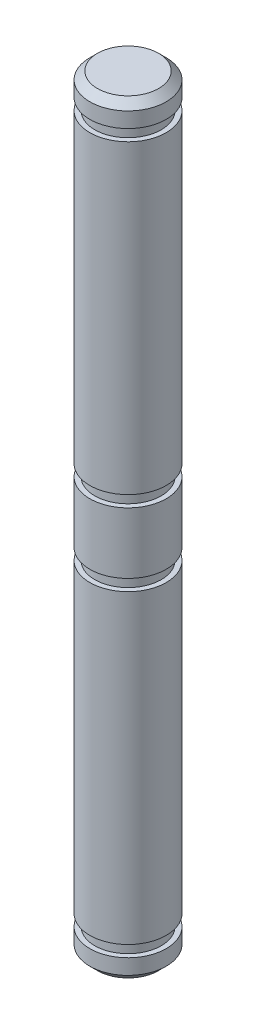
ISO-10303-21;
HEADER;
FILE_DESCRIPTION(('STEP AP214'),'2;1');
FILE_NAME('part.step','',(''),(''),'','','');
FILE_SCHEMA(('AUTOMOTIVE_DESIGN { 1 0 10303 214 1 1 1 1 }'));
ENDSEC;
DATA;
#1=APPLICATION_CONTEXT('core data for automotive mechanical design processes');
#2=APPLICATION_PROTOCOL_DEFINITION('international standard','automotive_design',2000,#1);
#3=PRODUCT_CONTEXT('',#1,'mechanical');
#4=PRODUCT('Part','Part','',(#3));
#5=PRODUCT_RELATED_PRODUCT_CATEGORY('part','',(#4));
#6=PRODUCT_DEFINITION_FORMATION('','',#4);
#7=PRODUCT_DEFINITION_CONTEXT('part definition',#1,'design');
#8=PRODUCT_DEFINITION('design','',#6,#7);
#9=PRODUCT_DEFINITION_SHAPE('','',#8);
#10=(LENGTH_UNIT() NAMED_UNIT(*) SI_UNIT(.MILLI.,.METRE.));
#11=(NAMED_UNIT(*) PLANE_ANGLE_UNIT() SI_UNIT($,.RADIAN.));
#12=(NAMED_UNIT(*) SI_UNIT($,.STERADIAN.) SOLID_ANGLE_UNIT());
#13=UNCERTAINTY_MEASURE_WITH_UNIT(LENGTH_MEASURE(1.E-05),#10,'distance_accuracy_value','');
#14=(GEOMETRIC_REPRESENTATION_CONTEXT(3) GLOBAL_UNCERTAINTY_ASSIGNED_CONTEXT((#13)) GLOBAL_UNIT_ASSIGNED_CONTEXT((#10,
#11,#12)) REPRESENTATION_CONTEXT('',''));
#15=CARTESIAN_POINT('',(0.,0.,0.));
#16=DIRECTION('',(0.,0.,1.));
#17=DIRECTION('',(1.,0.,0.));
#18=AXIS2_PLACEMENT_3D('',#15,#16,#17);
#19=CARTESIAN_POINT('',(0.,50.,0.));
#20=DIRECTION('',(0.,1.,0.));
#21=DIRECTION('',(0.,0.,1.));
#22=AXIS2_PLACEMENT_3D('',#19,#20,#21);
#23=PLANE('',#22);
#24=CARTESIAN_POINT('',(0.,50.,0.));
#25=DIRECTION('',(0.,-1.,0.));
#26=DIRECTION('',(0.,0.,-1.));
#27=AXIS2_PLACEMENT_3D('',#24,#25,#26);
#28=CIRCLE('',#27,2.);
#29=CARTESIAN_POINT('',(0.,50.,-2.));
#30=VERTEX_POINT('',#29);
#31=EDGE_CURVE('E10',#30,#30,#28,.T.);
#32=ORIENTED_EDGE('',*,*,#31,.F.);
#33=EDGE_LOOP('',(#32));
#34=FACE_BOUND('',#33,.T.);
#35=ADVANCED_FACE('F15',(#34),#23,.T.);
#36=CARTESIAN_POINT('',(0.,49.5,0.));
#37=DIRECTION('',(0.,-1.,0.));
#38=DIRECTION('',(0.,0.,-1.));
#39=AXIS2_PLACEMENT_3D('',#36,#37,#38);
#40=CONICAL_SURFACE('',#39,2.5,0.785398163397448);
#41=ORIENTED_EDGE('',*,*,#31,.T.);
#42=EDGE_LOOP('',(#41));
#43=FACE_BOUND('',#42,.T.);
#44=CARTESIAN_POINT('',(0.,49.5,0.));
#45=DIRECTION('',(0.,-1.,0.));
#46=DIRECTION('',(0.,0.,-1.));
#47=AXIS2_PLACEMENT_3D('',#44,#45,#46);
#48=CIRCLE('',#47,2.5);
#49=CARTESIAN_POINT('',(0.,49.5,-2.5));
#50=VERTEX_POINT('',#49);
#51=EDGE_CURVE('E21',#50,#50,#48,.T.);
#52=ORIENTED_EDGE('',*,*,#51,.F.);
#53=EDGE_LOOP('',(#52));
#54=FACE_BOUND('',#53,.T.);
#55=ADVANCED_FACE('F101',(#43,#54),#40,.T.);
#56=CARTESIAN_POINT('',(0.,0.,0.));
#57=DIRECTION('',(0.,-1.,0.));
#58=DIRECTION('',(0.,0.,-1.));
#59=AXIS2_PLACEMENT_3D('',#56,#57,#58);
#60=CYLINDRICAL_SURFACE('',#59,2.5);
#61=ORIENTED_EDGE('',*,*,#51,.T.);
#62=EDGE_LOOP('',(#61));
#63=FACE_BOUND('',#62,.T.);
#64=CARTESIAN_POINT('',(0.,48.5,0.));
#65=DIRECTION('',(0.,-1.,0.));
#66=DIRECTION('',(0.,0.,-1.));
#67=AXIS2_PLACEMENT_3D('',#64,#65,#66);
#68=CIRCLE('',#67,2.5);
#69=CARTESIAN_POINT('',(0.,48.5,-2.5));
#70=VERTEX_POINT('',#69);
#71=EDGE_CURVE('E25',#70,#70,#68,.T.);
#72=ORIENTED_EDGE('',*,*,#71,.F.);
#73=EDGE_LOOP('',(#72));
#74=FACE_BOUND('',#73,.T.);
#75=ADVANCED_FACE('F107',(#63,#74),#60,.T.);
#76=CARTESIAN_POINT('',(2.5,48.5,0.));
#77=DIRECTION('',(0.,-1.,0.));
#78=DIRECTION('',(0.,0.,-1.));
#79=AXIS2_PLACEMENT_3D('',#76,#77,#78);
#80=PLANE('',#79);
#81=ORIENTED_EDGE('',*,*,#71,.T.);
#82=EDGE_LOOP('',(#81));
#83=FACE_BOUND('',#82,.T.);
#84=CARTESIAN_POINT('',(0.,48.5,0.));
#85=DIRECTION('',(0.,-1.,0.));
#86=DIRECTION('',(0.,0.,-1.));
#87=AXIS2_PLACEMENT_3D('',#84,#85,#86);
#88=CIRCLE('',#87,2.175);
#89=CARTESIAN_POINT('',(0.,48.5,-2.175));
#90=VERTEX_POINT('',#89);
#91=EDGE_CURVE('E29',#90,#90,#88,.T.);
#92=ORIENTED_EDGE('',*,*,#91,.F.);
#93=EDGE_LOOP('',(#92));
#94=FACE_BOUND('',#93,.T.);
#95=ADVANCED_FACE('F112',(#83,#94),#80,.T.);
#96=CARTESIAN_POINT('',(0.,0.,0.));
#97=DIRECTION('',(0.,-1.,0.));
#98=DIRECTION('',(0.,0.,-1.));
#99=AXIS2_PLACEMENT_3D('',#96,#97,#98);
#100=CYLINDRICAL_SURFACE('',#99,2.175);
#101=ORIENTED_EDGE('',*,*,#91,.T.);
#102=EDGE_LOOP('',(#101));
#103=FACE_BOUND('',#102,.T.);
#104=CARTESIAN_POINT('',(0.,47.75,0.));
#105=DIRECTION('',(0.,-1.,0.));
#106=DIRECTION('',(0.,0.,-1.));
#107=AXIS2_PLACEMENT_3D('',#104,#105,#106);
#108=CIRCLE('',#107,2.175);
#109=CARTESIAN_POINT('',(0.,47.75,-2.175));
#110=VERTEX_POINT('',#109);
#111=EDGE_CURVE('E34',#110,#110,#108,.T.);
#112=ORIENTED_EDGE('',*,*,#111,.F.);
#113=EDGE_LOOP('',(#112));
#114=FACE_BOUND('',#113,.T.);
#115=ADVANCED_FACE('F118',(#103,#114),#100,.T.);
#116=CARTESIAN_POINT('',(2.175,47.75,0.));
#117=DIRECTION('',(0.,1.,0.));
#118=DIRECTION('',(0.,0.,1.));
#119=AXIS2_PLACEMENT_3D('',#116,#117,#118);
#120=PLANE('',#119);
#121=ORIENTED_EDGE('',*,*,#111,.T.);
#122=EDGE_LOOP('',(#121));
#123=FACE_BOUND('',#122,.T.);
#124=CARTESIAN_POINT('',(0.,47.75,0.));
#125=DIRECTION('',(0.,-1.,0.));
#126=DIRECTION('',(0.,0.,-1.));
#127=AXIS2_PLACEMENT_3D('',#124,#125,#126);
#128=CIRCLE('',#127,2.5);
#129=CARTESIAN_POINT('',(0.,47.75,-2.5));
#130=VERTEX_POINT('',#129);
#131=EDGE_CURVE('E37',#130,#130,#128,.T.);
#132=ORIENTED_EDGE('',*,*,#131,.F.);
#133=EDGE_LOOP('',(#132));
#134=FACE_BOUND('',#133,.T.);
#135=ADVANCED_FACE('F122',(#123,#134),#120,.T.);
#136=CARTESIAN_POINT('',(0.,0.,0.));
#137=DIRECTION('',(0.,-1.,0.));
#138=DIRECTION('',(0.,0.,-1.));
#139=AXIS2_PLACEMENT_3D('',#136,#137,#138);
#140=CYLINDRICAL_SURFACE('',#139,2.5);
#141=ORIENTED_EDGE('',*,*,#131,.T.);
#142=EDGE_LOOP('',(#141));
#143=FACE_BOUND('',#142,.T.);
#144=CARTESIAN_POINT('',(0.,27.75,0.));
#145=DIRECTION('',(0.,-1.,0.));
#146=DIRECTION('',(0.,0.,-1.));
#147=AXIS2_PLACEMENT_3D('',#144,#145,#146);
#148=CIRCLE('',#147,2.5);
#149=CARTESIAN_POINT('',(0.,27.75,-2.5));
#150=VERTEX_POINT('',#149);
#151=EDGE_CURVE('E40',#150,#150,#148,.T.);
#152=ORIENTED_EDGE('',*,*,#151,.F.);
#153=EDGE_LOOP('',(#152));
#154=FACE_BOUND('',#153,.T.);
#155=ADVANCED_FACE('F126',(#143,#154),#140,.T.);
#156=CARTESIAN_POINT('',(2.5,27.75,0.));
#157=DIRECTION('',(0.,-1.,0.));
#158=DIRECTION('',(0.,0.,-1.));
#159=AXIS2_PLACEMENT_3D('',#156,#157,#158);
#160=PLANE('',#159);
#161=ORIENTED_EDGE('',*,*,#151,.T.);
#162=EDGE_LOOP('',(#161));
#163=FACE_BOUND('',#162,.T.);
#164=CARTESIAN_POINT('',(0.,27.75,0.));
#165=DIRECTION('',(0.,-1.,0.));
#166=DIRECTION('',(0.,0.,-1.));
#167=AXIS2_PLACEMENT_3D('',#164,#165,#166);
#168=CIRCLE('',#167,2.175);
#169=CARTESIAN_POINT('',(0.,27.75,-2.175));
#170=VERTEX_POINT('',#169);
#171=EDGE_CURVE('E43',#170,#170,#168,.T.);
#172=ORIENTED_EDGE('',*,*,#171,.F.);
#173=EDGE_LOOP('',(#172));
#174=FACE_BOUND('',#173,.T.);
#175=ADVANCED_FACE('F130',(#163,#174),#160,.T.);
#176=CARTESIAN_POINT('',(0.,0.,0.));
#177=DIRECTION('',(0.,-1.,0.));
#178=DIRECTION('',(0.,0.,-1.));
#179=AXIS2_PLACEMENT_3D('',#176,#177,#178);
#180=CYLINDRICAL_SURFACE('',#179,2.175);
#181=ORIENTED_EDGE('',*,*,#171,.T.);
#182=EDGE_LOOP('',(#181));
#183=FACE_BOUND('',#182,.T.);
#184=CARTESIAN_POINT('',(0.,27.,0.));
#185=DIRECTION('',(0.,-1.,0.));
#186=DIRECTION('',(0.,0.,-1.));
#187=AXIS2_PLACEMENT_3D('',#184,#185,#186);
#188=CIRCLE('',#187,2.175);
#189=CARTESIAN_POINT('',(0.,27.,-2.175));
#190=VERTEX_POINT('',#189);
#191=EDGE_CURVE('E46',#190,#190,#188,.T.);
#192=ORIENTED_EDGE('',*,*,#191,.F.);
#193=EDGE_LOOP('',(#192));
#194=FACE_BOUND('',#193,.T.);
#195=ADVANCED_FACE('F134',(#183,#194),#180,.T.);
#196=CARTESIAN_POINT('',(2.175,27.,0.));
#197=DIRECTION('',(0.,1.,0.));
#198=DIRECTION('',(0.,0.,1.));
#199=AXIS2_PLACEMENT_3D('',#196,#197,#198);
#200=PLANE('',#199);
#201=ORIENTED_EDGE('',*,*,#191,.T.);
#202=EDGE_LOOP('',(#201));
#203=FACE_BOUND('',#202,.T.);
#204=CARTESIAN_POINT('',(0.,27.,0.));
#205=DIRECTION('',(0.,-1.,0.));
#206=DIRECTION('',(0.,0.,-1.));
#207=AXIS2_PLACEMENT_3D('',#204,#205,#206);
#208=CIRCLE('',#207,2.5);
#209=CARTESIAN_POINT('',(0.,27.,-2.5));
#210=VERTEX_POINT('',#209);
#211=EDGE_CURVE('E49',#210,#210,#208,.T.);
#212=ORIENTED_EDGE('',*,*,#211,.F.);
#213=EDGE_LOOP('',(#212));
#214=FACE_BOUND('',#213,.T.);
#215=ADVANCED_FACE('F138',(#203,#214),#200,.T.);
#216=CARTESIAN_POINT('',(0.,0.,0.));
#217=DIRECTION('',(0.,-1.,0.));
#218=DIRECTION('',(0.,0.,-1.));
#219=AXIS2_PLACEMENT_3D('',#216,#217,#218);
#220=CYLINDRICAL_SURFACE('',#219,2.5);
#221=ORIENTED_EDGE('',*,*,#211,.T.);
#222=EDGE_LOOP('',(#221));
#223=FACE_BOUND('',#222,.T.);
#224=CARTESIAN_POINT('',(0.,23.,0.));
#225=DIRECTION('',(0.,-1.,0.));
#226=DIRECTION('',(0.,0.,-1.));
#227=AXIS2_PLACEMENT_3D('',#224,#225,#226);
#228=CIRCLE('',#227,2.5);
#229=CARTESIAN_POINT('',(0.,23.,-2.5));
#230=VERTEX_POINT('',#229);
#231=EDGE_CURVE('E52',#230,#230,#228,.T.);
#232=ORIENTED_EDGE('',*,*,#231,.F.);
#233=EDGE_LOOP('',(#232));
#234=FACE_BOUND('',#233,.T.);
#235=ADVANCED_FACE('F142',(#223,#234),#220,.T.);
#236=CARTESIAN_POINT('',(2.175,23.,0.));
#237=DIRECTION('',(0.,-1.,0.));
#238=DIRECTION('',(0.,0.,-1.));
#239=AXIS2_PLACEMENT_3D('',#236,#237,#238);
#240=PLANE('',#239);
#241=ORIENTED_EDGE('',*,*,#231,.T.);
#242=EDGE_LOOP('',(#241));
#243=FACE_BOUND('',#242,.T.);
#244=CARTESIAN_POINT('',(0.,23.,0.));
#245=DIRECTION('',(0.,-1.,0.));
#246=DIRECTION('',(0.,0.,-1.));
#247=AXIS2_PLACEMENT_3D('',#244,#245,#246);
#248=CIRCLE('',#247,2.175);
#249=CARTESIAN_POINT('',(0.,23.,-2.175));
#250=VERTEX_POINT('',#249);
#251=EDGE_CURVE('E55',#250,#250,#248,.T.);
#252=ORIENTED_EDGE('',*,*,#251,.F.);
#253=EDGE_LOOP('',(#252));
#254=FACE_BOUND('',#253,.T.);
#255=ADVANCED_FACE('F146',(#243,#254),#240,.T.);
#256=CARTESIAN_POINT('',(0.,0.,0.));
#257=DIRECTION('',(0.,-1.,0.));
#258=DIRECTION('',(0.,0.,-1.));
#259=AXIS2_PLACEMENT_3D('',#256,#257,#258);
#260=CYLINDRICAL_SURFACE('',#259,2.175);
#261=ORIENTED_EDGE('',*,*,#251,.T.);
#262=EDGE_LOOP('',(#261));
#263=FACE_BOUND('',#262,.T.);
#264=CARTESIAN_POINT('',(0.,22.25,0.));
#265=DIRECTION('',(0.,-1.,0.));
#266=DIRECTION('',(0.,0.,-1.));
#267=AXIS2_PLACEMENT_3D('',#264,#265,#266);
#268=CIRCLE('',#267,2.175);
#269=CARTESIAN_POINT('',(0.,22.25,-2.175));
#270=VERTEX_POINT('',#269);
#271=EDGE_CURVE('E58',#270,#270,#268,.T.);
#272=ORIENTED_EDGE('',*,*,#271,.F.);
#273=EDGE_LOOP('',(#272));
#274=FACE_BOUND('',#273,.T.);
#275=ADVANCED_FACE('F150',(#263,#274),#260,.T.);
#276=CARTESIAN_POINT('',(2.5,22.25,0.));
#277=DIRECTION('',(0.,1.,0.));
#278=DIRECTION('',(0.,0.,1.));
#279=AXIS2_PLACEMENT_3D('',#276,#277,#278);
#280=PLANE('',#279);
#281=ORIENTED_EDGE('',*,*,#271,.T.);
#282=EDGE_LOOP('',(#281));
#283=FACE_BOUND('',#282,.T.);
#284=CARTESIAN_POINT('',(0.,22.25,0.));
#285=DIRECTION('',(0.,-1.,0.));
#286=DIRECTION('',(0.,0.,-1.));
#287=AXIS2_PLACEMENT_3D('',#284,#285,#286);
#288=CIRCLE('',#287,2.5);
#289=CARTESIAN_POINT('',(0.,22.25,-2.5));
#290=VERTEX_POINT('',#289);
#291=EDGE_CURVE('E61',#290,#290,#288,.T.);
#292=ORIENTED_EDGE('',*,*,#291,.F.);
#293=EDGE_LOOP('',(#292));
#294=FACE_BOUND('',#293,.T.);
#295=ADVANCED_FACE('F154',(#283,#294),#280,.T.);
#296=CARTESIAN_POINT('',(0.,0.,0.));
#297=DIRECTION('',(0.,-1.,0.));
#298=DIRECTION('',(0.,0.,-1.));
#299=AXIS2_PLACEMENT_3D('',#296,#297,#298);
#300=CYLINDRICAL_SURFACE('',#299,2.5);
#301=ORIENTED_EDGE('',*,*,#291,.T.);
#302=EDGE_LOOP('',(#301));
#303=FACE_BOUND('',#302,.T.);
#304=CARTESIAN_POINT('',(0.,2.25,0.));
#305=DIRECTION('',(0.,-1.,0.));
#306=DIRECTION('',(0.,0.,-1.));
#307=AXIS2_PLACEMENT_3D('',#304,#305,#306);
#308=CIRCLE('',#307,2.5);
#309=CARTESIAN_POINT('',(0.,2.25,-2.5));
#310=VERTEX_POINT('',#309);
#311=EDGE_CURVE('E64',#310,#310,#308,.T.);
#312=ORIENTED_EDGE('',*,*,#311,.F.);
#313=EDGE_LOOP('',(#312));
#314=FACE_BOUND('',#313,.T.);
#315=ADVANCED_FACE('F158',(#303,#314),#300,.T.);
#316=CARTESIAN_POINT('',(2.175,2.25,0.));
#317=DIRECTION('',(0.,-1.,0.));
#318=DIRECTION('',(0.,0.,-1.));
#319=AXIS2_PLACEMENT_3D('',#316,#317,#318);
#320=PLANE('',#319);
#321=ORIENTED_EDGE('',*,*,#311,.T.);
#322=EDGE_LOOP('',(#321));
#323=FACE_BOUND('',#322,.T.);
#324=CARTESIAN_POINT('',(0.,2.25,0.));
#325=DIRECTION('',(0.,-1.,0.));
#326=DIRECTION('',(0.,0.,-1.));
#327=AXIS2_PLACEMENT_3D('',#324,#325,#326);
#328=CIRCLE('',#327,2.175);
#329=CARTESIAN_POINT('',(0.,2.25,-2.175));
#330=VERTEX_POINT('',#329);
#331=EDGE_CURVE('E67',#330,#330,#328,.T.);
#332=ORIENTED_EDGE('',*,*,#331,.F.);
#333=EDGE_LOOP('',(#332));
#334=FACE_BOUND('',#333,.T.);
#335=ADVANCED_FACE('F162',(#323,#334),#320,.T.);
#336=CARTESIAN_POINT('',(0.,0.,0.));
#337=DIRECTION('',(0.,-1.,0.));
#338=DIRECTION('',(0.,0.,-1.));
#339=AXIS2_PLACEMENT_3D('',#336,#337,#338);
#340=CYLINDRICAL_SURFACE('',#339,2.175);
#341=ORIENTED_EDGE('',*,*,#331,.T.);
#342=EDGE_LOOP('',(#341));
#343=FACE_BOUND('',#342,.T.);
#344=CARTESIAN_POINT('',(0.,1.5,0.));
#345=DIRECTION('',(0.,-1.,0.));
#346=DIRECTION('',(0.,0.,-1.));
#347=AXIS2_PLACEMENT_3D('',#344,#345,#346);
#348=CIRCLE('',#347,2.175);
#349=CARTESIAN_POINT('',(0.,1.5,-2.175));
#350=VERTEX_POINT('',#349);
#351=EDGE_CURVE('E70',#350,#350,#348,.T.);
#352=ORIENTED_EDGE('',*,*,#351,.F.);
#353=EDGE_LOOP('',(#352));
#354=FACE_BOUND('',#353,.T.);
#355=ADVANCED_FACE('F166',(#343,#354),#340,.T.);
#356=CARTESIAN_POINT('',(2.5,1.5,0.));
#357=DIRECTION('',(0.,1.,0.));
#358=DIRECTION('',(0.,0.,1.));
#359=AXIS2_PLACEMENT_3D('',#356,#357,#358);
#360=PLANE('',#359);
#361=ORIENTED_EDGE('',*,*,#351,.T.);
#362=EDGE_LOOP('',(#361));
#363=FACE_BOUND('',#362,.T.);
#364=CARTESIAN_POINT('',(0.,1.5,0.));
#365=DIRECTION('',(0.,-1.,0.));
#366=DIRECTION('',(0.,0.,-1.));
#367=AXIS2_PLACEMENT_3D('',#364,#365,#366);
#368=CIRCLE('',#367,2.5);
#369=CARTESIAN_POINT('',(0.,1.5,-2.5));
#370=VERTEX_POINT('',#369);
#371=EDGE_CURVE('E73',#370,#370,#368,.T.);
#372=ORIENTED_EDGE('',*,*,#371,.F.);
#373=EDGE_LOOP('',(#372));
#374=FACE_BOUND('',#373,.T.);
#375=ADVANCED_FACE('F97',(#363,#374),#360,.T.);
#376=CARTESIAN_POINT('',(0.,0.,0.));
#377=DIRECTION('',(0.,-1.,0.));
#378=DIRECTION('',(0.,0.,-1.));
#379=AXIS2_PLACEMENT_3D('',#376,#377,#378);
#380=CYLINDRICAL_SURFACE('',#379,2.5);
#381=ORIENTED_EDGE('',*,*,#371,.T.);
#382=EDGE_LOOP('',(#381));
#383=FACE_BOUND('',#382,.T.);
#384=CARTESIAN_POINT('',(0.,0.5,0.));
#385=DIRECTION('',(0.,-1.,0.));
#386=DIRECTION('',(0.,0.,-1.));
#387=AXIS2_PLACEMENT_3D('',#384,#385,#386);
#388=CIRCLE('',#387,2.5);
#389=CARTESIAN_POINT('',(0.,0.5,-2.5));
#390=VERTEX_POINT('',#389);
#391=EDGE_CURVE('E76',#390,#390,#388,.T.);
#392=ORIENTED_EDGE('',*,*,#391,.F.);
#393=EDGE_LOOP('',(#392));
#394=FACE_BOUND('',#393,.T.);
#395=ADVANCED_FACE('F87',(#383,#394),#380,.T.);
#396=CARTESIAN_POINT('',(0.,0.,0.));
#397=DIRECTION('',(0.,1.,0.));
#398=DIRECTION('',(0.,0.,1.));
#399=AXIS2_PLACEMENT_3D('',#396,#397,#398);
#400=CONICAL_SURFACE('',#399,2.,0.785398163397448);
#401=ORIENTED_EDGE('',*,*,#391,.T.);
#402=EDGE_LOOP('',(#401));
#403=FACE_BOUND('',#402,.T.);
#404=CARTESIAN_POINT('',(0.,0.,0.));
#405=DIRECTION('',(0.,-1.,0.));
#406=DIRECTION('',(0.,0.,-1.));
#407=AXIS2_PLACEMENT_3D('',#404,#405,#406);
#408=CIRCLE('',#407,2.);
#409=CARTESIAN_POINT('',(0.,0.,-2.));
#410=VERTEX_POINT('',#409);
#411=EDGE_CURVE('E79',#410,#410,#408,.T.);
#412=ORIENTED_EDGE('',*,*,#411,.F.);
#413=EDGE_LOOP('',(#412));
#414=FACE_BOUND('',#413,.T.);
#415=ADVANCED_FACE('F85',(#403,#414),#400,.T.);
#416=CARTESIAN_POINT('',(0.,0.,0.));
#417=DIRECTION('',(0.,-1.,0.));
#418=DIRECTION('',(0.,0.,-1.));
#419=AXIS2_PLACEMENT_3D('',#416,#417,#418);
#420=PLANE('',#419);
#421=ORIENTED_EDGE('',*,*,#411,.T.);
#422=EDGE_LOOP('',(#421));
#423=FACE_BOUND('',#422,.T.);
#424=ADVANCED_FACE('F83',(#423),#420,.T.);
#425=CLOSED_SHELL('',(#35,#55,#75,#95,#115,#135,#155,#175,#195,#215,#235,#255,#275,#295,#315,
#335,#355,#375,#395,#415,#424));
#426=MANIFOLD_SOLID_BREP('B1',#425);
#427=ADVANCED_BREP_SHAPE_REPRESENTATION('',(#18,#426),#14);
#428=SHAPE_DEFINITION_REPRESENTATION(#9,#427);
ENDSEC;
END-ISO-10303-21;
